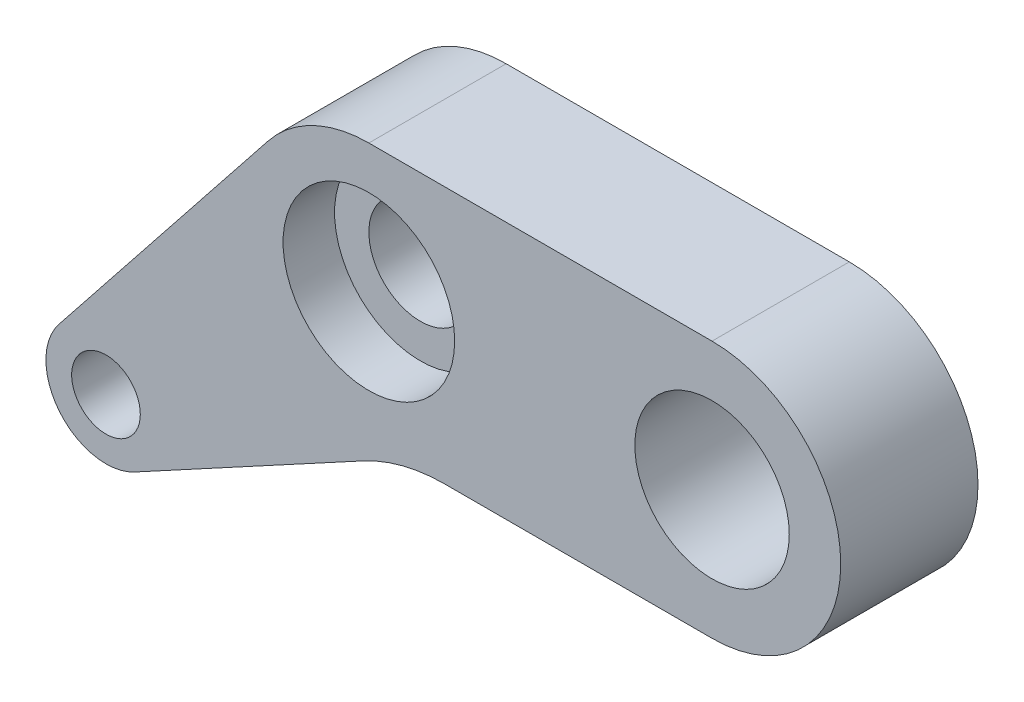
ISO-10303-21;
HEADER;
FILE_DESCRIPTION(('STEP AP214'),'2;1');
FILE_NAME('part.step','',(''),(''),'','','');
FILE_SCHEMA(('AUTOMOTIVE_DESIGN { 1 0 10303 214 1 1 1 1 }'));
ENDSEC;
DATA;
#1=APPLICATION_CONTEXT('core data for automotive mechanical design processes');
#2=APPLICATION_PROTOCOL_DEFINITION('international standard','automotive_design',2000,#1);
#3=PRODUCT_CONTEXT('',#1,'mechanical');
#4=PRODUCT('Part','Part','',(#3));
#5=PRODUCT_RELATED_PRODUCT_CATEGORY('part','',(#4));
#6=PRODUCT_DEFINITION_FORMATION('','',#4);
#7=PRODUCT_DEFINITION_CONTEXT('part definition',#1,'design');
#8=PRODUCT_DEFINITION('design','',#6,#7);
#9=PRODUCT_DEFINITION_SHAPE('','',#8);
#10=(LENGTH_UNIT() NAMED_UNIT(*) SI_UNIT(.MILLI.,.METRE.));
#11=(NAMED_UNIT(*) PLANE_ANGLE_UNIT() SI_UNIT($,.RADIAN.));
#12=(NAMED_UNIT(*) SI_UNIT($,.STERADIAN.) SOLID_ANGLE_UNIT());
#13=UNCERTAINTY_MEASURE_WITH_UNIT(LENGTH_MEASURE(1.E-05),#10,'distance_accuracy_value','');
#14=(GEOMETRIC_REPRESENTATION_CONTEXT(3) GLOBAL_UNCERTAINTY_ASSIGNED_CONTEXT((#13)) GLOBAL_UNIT_ASSIGNED_CONTEXT((#10,
#11,#12)) REPRESENTATION_CONTEXT('',''));
#15=CARTESIAN_POINT('',(0.,0.,0.));
#16=DIRECTION('',(0.,0.,1.));
#17=DIRECTION('',(1.,0.,0.));
#18=AXIS2_PLACEMENT_3D('',#15,#16,#17);
#19=CARTESIAN_POINT('',(-20.,0.,8.));
#20=DIRECTION('',(0.,0.,-1.));
#21=DIRECTION('',(-1.,0.,0.));
#22=AXIS2_PLACEMENT_3D('',#19,#20,#21);
#23=CYLINDRICAL_SURFACE('',#22,3.);
#24=CARTESIAN_POINT('',(-20.,0.,0.));
#25=DIRECTION('',(0.,0.,1.));
#26=DIRECTION('',(1.,0.,0.));
#27=AXIS2_PLACEMENT_3D('',#24,#25,#26);
#28=CIRCLE('',#27,3.);
#29=CARTESIAN_POINT('',(-17.,0.,0.));
#30=VERTEX_POINT('',#29);
#31=EDGE_CURVE('E163',#30,#30,#28,.T.);
#32=ORIENTED_EDGE('',*,*,#31,.F.);
#33=EDGE_LOOP('',(#32));
#34=FACE_BOUND('',#33,.T.);
#35=CARTESIAN_POINT('',(-20.,0.,5.));
#36=DIRECTION('',(0.,0.,1.));
#37=DIRECTION('',(1.,0.,0.));
#38=AXIS2_PLACEMENT_3D('',#35,#36,#37);
#39=CIRCLE('',#38,3.);
#40=CARTESIAN_POINT('',(-17.,0.,5.));
#41=VERTEX_POINT('',#40);
#42=EDGE_CURVE('E53',#41,#41,#39,.T.);
#43=ORIENTED_EDGE('',*,*,#42,.T.);
#44=EDGE_LOOP('',(#43));
#45=FACE_BOUND('',#44,.T.);
#46=ADVANCED_FACE('F49',(#34,#45),#23,.F.);
#47=CARTESIAN_POINT('',(0.,7.5,8.));
#48=DIRECTION('',(0.,-1.,0.));
#49=DIRECTION('',(1.,0.,0.));
#50=AXIS2_PLACEMENT_3D('',#47,#48,#49);
#51=PLANE('',#50);
#52=DIRECTION('',(-1.,0.,0.));
#53=VECTOR('',#52,1.);
#54=CARTESIAN_POINT('',(0.,7.5,0.));
#55=LINE('',#54,#53);
#56=CARTESIAN_POINT('',(0.,7.5,0.));
#57=VERTEX_POINT('',#56);
#58=CARTESIAN_POINT('',(-20.,7.5,0.));
#59=VERTEX_POINT('',#58);
#60=EDGE_CURVE('E142',#57,#59,#55,.T.);
#61=ORIENTED_EDGE('',*,*,#60,.T.);
#62=DIRECTION('',(0.,0.,-1.));
#63=VECTOR('',#62,1.);
#64=CARTESIAN_POINT('',(-20.,7.5,8.));
#65=LINE('',#64,#63);
#66=CARTESIAN_POINT('',(-20.,7.5,8.));
#67=VERTEX_POINT('',#66);
#68=EDGE_CURVE('E120',#67,#59,#65,.T.);
#69=ORIENTED_EDGE('',*,*,#68,.F.);
#70=DIRECTION('',(-1.,0.,0.));
#71=VECTOR('',#70,1.);
#72=CARTESIAN_POINT('',(0.,7.5,8.));
#73=LINE('',#72,#71);
#74=CARTESIAN_POINT('',(0.,7.5,8.));
#75=VERTEX_POINT('',#74);
#76=EDGE_CURVE('E127',#75,#67,#73,.T.);
#77=ORIENTED_EDGE('',*,*,#76,.F.);
#78=DIRECTION('',(0.,0.,-1.));
#79=VECTOR('',#78,1.);
#80=CARTESIAN_POINT('',(0.,7.5,8.));
#81=LINE('',#80,#79);
#82=EDGE_CURVE('E158',#75,#57,#81,.T.);
#83=ORIENTED_EDGE('',*,*,#82,.T.);
#84=EDGE_LOOP('',(#61,#69,#77,#83));
#85=FACE_BOUND('',#84,.T.);
#86=ADVANCED_FACE('F140',(#85),#51,.F.);
#87=CARTESIAN_POINT('',(-20.,0.,8.));
#88=DIRECTION('',(0.,0.,-1.));
#89=DIRECTION('',(-1.,0.,0.));
#90=AXIS2_PLACEMENT_3D('',#87,#88,#89);
#91=CYLINDRICAL_SURFACE('',#90,7.5);
#92=CARTESIAN_POINT('',(-20.,0.,0.));
#93=DIRECTION('',(0.,0.,1.));
#94=DIRECTION('',(1.,0.,0.));
#95=AXIS2_PLACEMENT_3D('',#92,#93,#94);
#96=CIRCLE('',#95,7.5);
#97=CARTESIAN_POINT('',(-25.8725716348244,4.66507260327814,0.));
#98=VERTEX_POINT('',#97);
#99=EDGE_CURVE('E180',#59,#98,#96,.T.);
#100=ORIENTED_EDGE('',*,*,#99,.T.);
#101=DIRECTION('',(0.,0.,-1.));
#102=VECTOR('',#101,1.);
#103=CARTESIAN_POINT('',(-25.8725716348244,4.66507260327814,8.));
#104=LINE('',#103,#102);
#105=CARTESIAN_POINT('',(-25.8725716348244,4.66507260327814,8.));
#106=VERTEX_POINT('',#105);
#107=EDGE_CURVE('E122',#106,#98,#104,.T.);
#108=ORIENTED_EDGE('',*,*,#107,.F.);
#109=CARTESIAN_POINT('',(-20.,0.,8.));
#110=DIRECTION('',(0.,0.,1.));
#111=DIRECTION('',(1.,0.,0.));
#112=AXIS2_PLACEMENT_3D('',#109,#110,#111);
#113=CIRCLE('',#112,7.5);
#114=EDGE_CURVE('E115',#67,#106,#113,.T.);
#115=ORIENTED_EDGE('',*,*,#114,.F.);
#116=ORIENTED_EDGE('',*,*,#68,.T.);
#117=EDGE_LOOP('',(#100,#108,#115,#116));
#118=FACE_BOUND('',#117,.T.);
#119=ADVANCED_FACE('F118',(#118),#91,.T.);
#120=CARTESIAN_POINT('',(-18.1346507836754,14.4058630190675,8.));
#121=DIRECTION('',(-0.783009551309914,0.622009680437087,0.));
#122=DIRECTION('',(-0.622009680437087,-0.783009551309914,0.));
#123=AXIS2_PLACEMENT_3D('',#120,#121,#122);
#124=PLANE('',#123);
#125=DIRECTION('',(0.622009680437087,0.783009551309914,0.));
#126=VECTOR('',#125,1.);
#127=CARTESIAN_POINT('',(-18.1346507836754,14.4058630190675,0.));
#128=LINE('',#127,#126);
#129=CARTESIAN_POINT('',(-38.0614222919642,-10.678718312201,0.));
#130=VERTEX_POINT('',#129);
#131=EDGE_CURVE('E177',#130,#98,#128,.T.);
#132=ORIENTED_EDGE('',*,*,#131,.F.);
#133=DIRECTION('',(0.,0.,-1.));
#134=VECTOR('',#133,1.);
#135=CARTESIAN_POINT('',(-38.0614222919642,-10.678718312201,8.));
#136=LINE('',#135,#134);
#137=CARTESIAN_POINT('',(-38.0614222919642,-10.678718312201,8.));
#138=VERTEX_POINT('',#137);
#139=EDGE_CURVE('E147',#138,#130,#136,.T.);
#140=ORIENTED_EDGE('',*,*,#139,.F.);
#141=DIRECTION('',(0.622009680437087,0.783009551309914,0.));
#142=VECTOR('',#141,1.);
#143=CARTESIAN_POINT('',(-18.1346507836754,14.4058630190675,8.));
#144=LINE('',#143,#142);
#145=EDGE_CURVE('E126',#138,#106,#144,.T.);
#146=ORIENTED_EDGE('',*,*,#145,.T.);
#147=ORIENTED_EDGE('',*,*,#107,.T.);
#148=EDGE_LOOP('',(#132,#140,#146,#147));
#149=FACE_BOUND('',#148,.T.);
#150=ADVANCED_FACE('F246',(#149),#124,.T.);
#151=CARTESIAN_POINT('',(-35.3208888623795,-12.8557521937308,8.));
#152=DIRECTION('',(0.,0.,-1.));
#153=DIRECTION('',(-1.,0.,0.));
#154=AXIS2_PLACEMENT_3D('',#151,#152,#153);
#155=CYLINDRICAL_SURFACE('',#154,3.5);
#156=CARTESIAN_POINT('',(-35.3208888623795,-12.8557521937308,0.));
#157=DIRECTION('',(0.,0.,1.));
#158=DIRECTION('',(1.,0.,0.));
#159=AXIS2_PLACEMENT_3D('',#156,#157,#158);
#160=CIRCLE('',#159,3.5);
#161=CARTESIAN_POINT('',(-33.6528176531614,-15.9326887288218,0.));
#162=VERTEX_POINT('',#161);
#163=EDGE_CURVE('E175',#130,#162,#160,.T.);
#164=ORIENTED_EDGE('',*,*,#163,.T.);
#165=DIRECTION('',(0.,0.,-1.));
#166=VECTOR('',#165,1.);
#167=CARTESIAN_POINT('',(-33.6528176531614,-15.9326887288218,8.));
#168=LINE('',#167,#166);
#169=CARTESIAN_POINT('',(-33.6528176531614,-15.9326887288218,8.));
#170=VERTEX_POINT('',#169);
#171=EDGE_CURVE('E153',#170,#162,#168,.T.);
#172=ORIENTED_EDGE('',*,*,#171,.F.);
#173=CARTESIAN_POINT('',(-35.3208888623795,-12.8557521937308,8.));
#174=DIRECTION('',(0.,0.,1.));
#175=DIRECTION('',(1.,0.,0.));
#176=AXIS2_PLACEMENT_3D('',#173,#174,#175);
#177=CIRCLE('',#176,3.5);
#178=EDGE_CURVE('E194',#138,#170,#177,.T.);
#179=ORIENTED_EDGE('',*,*,#178,.F.);
#180=ORIENTED_EDGE('',*,*,#139,.T.);
#181=EDGE_LOOP('',(#164,#172,#179,#180));
#182=FACE_BOUND('',#181,.T.);
#183=ADVANCED_FACE('F243',(#182),#155,.T.);
#184=CARTESIAN_POINT('',(-0.96835607661003,1.78623680729754,8.));
#185=DIRECTION('',(-0.476591774062324,0.879124724311703,0.));
#186=DIRECTION('',(-0.879124724311703,-0.476591774062324,0.));
#187=AXIS2_PLACEMENT_3D('',#184,#185,#186);
#188=PLANE('',#187);
#189=DIRECTION('',(0.879124724311703,0.476591774062324,0.));
#190=VECTOR('',#189,1.);
#191=CARTESIAN_POINT('',(-0.96835607661003,1.78623680729754,0.));
#192=LINE('',#191,#190);
#193=CARTESIAN_POINT('',(-20.327491733991,-8.70875275688297,0.));
#194=VERTEX_POINT('',#193);
#195=EDGE_CURVE('E173',#162,#194,#192,.T.);
#196=ORIENTED_EDGE('',*,*,#195,.T.);
#197=DIRECTION('',(0.,0.,-1.));
#198=VECTOR('',#197,1.);
#199=CARTESIAN_POINT('',(-20.327491733991,-8.70875275688297,8.));
#200=LINE('',#199,#198);
#201=CARTESIAN_POINT('',(-20.327491733991,-8.70875275688297,8.));
#202=VERTEX_POINT('',#201);
#203=EDGE_CURVE('E65',#194,#202,#200,.F.);
#204=ORIENTED_EDGE('',*,*,#203,.T.);
#205=DIRECTION('',(0.879124724311703,0.476591774062324,0.));
#206=VECTOR('',#205,1.);
#207=CARTESIAN_POINT('',(-0.96835607661003,1.78623680729754,8.));
#208=LINE('',#207,#206);
#209=EDGE_CURVE('E192',#170,#202,#208,.T.);
#210=ORIENTED_EDGE('',*,*,#209,.F.);
#211=ORIENTED_EDGE('',*,*,#171,.T.);
#212=EDGE_LOOP('',(#196,#204,#210,#211));
#213=FACE_BOUND('',#212,.T.);
#214=ADVANCED_FACE('F239',(#213),#188,.F.);
#215=CARTESIAN_POINT('',(0.,-7.5,8.));
#216=DIRECTION('',(0.,-1.,0.));
#217=DIRECTION('',(1.,0.,0.));
#218=AXIS2_PLACEMENT_3D('',#215,#216,#217);
#219=PLANE('',#218);
#220=DIRECTION('',(-1.,0.,0.));
#221=VECTOR('',#220,1.);
#222=CARTESIAN_POINT('',(0.,-7.5,8.));
#223=LINE('',#222,#221);
#224=CARTESIAN_POINT('',(0.,-7.5,8.));
#225=VERTEX_POINT('',#224);
#226=CARTESIAN_POINT('',(-15.5615739933678,-7.5,8.));
#227=VERTEX_POINT('',#226);
#228=EDGE_CURVE('E189',#225,#227,#223,.T.);
#229=ORIENTED_EDGE('',*,*,#228,.T.);
#230=DIRECTION('',(0.,0.,-1.));
#231=VECTOR('',#230,1.);
#232=CARTESIAN_POINT('',(-15.5615739933678,-7.5,8.));
#233=LINE('',#232,#231);
#234=CARTESIAN_POINT('',(-15.5615739933678,-7.5,0.));
#235=VERTEX_POINT('',#234);
#236=EDGE_CURVE('E143',#227,#235,#233,.T.);
#237=ORIENTED_EDGE('',*,*,#236,.T.);
#238=DIRECTION('',(-1.,0.,0.));
#239=VECTOR('',#238,1.);
#240=CARTESIAN_POINT('',(0.,-7.5,0.));
#241=LINE('',#240,#239);
#242=CARTESIAN_POINT('',(0.,-7.5,0.));
#243=VERTEX_POINT('',#242);
#244=EDGE_CURVE('E171',#243,#235,#241,.T.);
#245=ORIENTED_EDGE('',*,*,#244,.F.);
#246=DIRECTION('',(0.,0.,-1.));
#247=VECTOR('',#246,1.);
#248=CARTESIAN_POINT('',(0.,-7.5,8.));
#249=LINE('',#248,#247);
#250=EDGE_CURVE('E156',#225,#243,#249,.T.);
#251=ORIENTED_EDGE('',*,*,#250,.F.);
#252=EDGE_LOOP('',(#229,#237,#245,#251));
#253=FACE_BOUND('',#252,.T.);
#254=ADVANCED_FACE('F232',(#253),#219,.T.);
#255=CARTESIAN_POINT('',(-35.3208888623795,-12.8557521937308,8.));
#256=DIRECTION('',(0.,0.,-1.));
#257=DIRECTION('',(-1.,0.,0.));
#258=AXIS2_PLACEMENT_3D('',#255,#256,#257);
#259=CYLINDRICAL_SURFACE('',#258,2.);
#260=CARTESIAN_POINT('',(-35.3208888623795,-12.8557521937308,8.));
#261=DIRECTION('',(0.,0.,1.));
#262=DIRECTION('',(1.,0.,0.));
#263=AXIS2_PLACEMENT_3D('',#260,#261,#262);
#264=CIRCLE('',#263,2.);
#265=CARTESIAN_POINT('',(-33.3208888623795,-12.8557521937308,8.));
#266=VERTEX_POINT('',#265);
#267=EDGE_CURVE('E185',#266,#266,#264,.T.);
#268=ORIENTED_EDGE('',*,*,#267,.T.);
#269=EDGE_LOOP('',(#268));
#270=FACE_BOUND('',#269,.T.);
#271=CARTESIAN_POINT('',(-35.3208888623795,-12.8557521937308,0.));
#272=DIRECTION('',(0.,0.,1.));
#273=DIRECTION('',(1.,0.,0.));
#274=AXIS2_PLACEMENT_3D('',#271,#272,#273);
#275=CIRCLE('',#274,2.);
#276=CARTESIAN_POINT('',(-33.3208888623795,-12.8557521937308,0.));
#277=VERTEX_POINT('',#276);
#278=EDGE_CURVE('E166',#277,#277,#275,.T.);
#279=ORIENTED_EDGE('',*,*,#278,.F.);
#280=EDGE_LOOP('',(#279));
#281=FACE_BOUND('',#280,.T.);
#282=ADVANCED_FACE('F228',(#270,#281),#259,.F.);
#283=CARTESIAN_POINT('',(0.,0.,8.));
#284=DIRECTION('',(0.,0.,-1.));
#285=DIRECTION('',(-1.,0.,0.));
#286=AXIS2_PLACEMENT_3D('',#283,#284,#285);
#287=CYLINDRICAL_SURFACE('',#286,7.5);
#288=CARTESIAN_POINT('',(0.,0.,0.));
#289=DIRECTION('',(0.,0.,1.));
#290=DIRECTION('',(1.,0.,0.));
#291=AXIS2_PLACEMENT_3D('',#288,#289,#290);
#292=CIRCLE('',#291,7.5);
#293=EDGE_CURVE('E169',#243,#57,#292,.T.);
#294=ORIENTED_EDGE('',*,*,#293,.T.);
#295=ORIENTED_EDGE('',*,*,#82,.F.);
#296=CARTESIAN_POINT('',(0.,0.,8.));
#297=DIRECTION('',(0.,0.,1.));
#298=DIRECTION('',(1.,0.,0.));
#299=AXIS2_PLACEMENT_3D('',#296,#297,#298);
#300=CIRCLE('',#299,7.5);
#301=EDGE_CURVE('E134',#225,#75,#300,.T.);
#302=ORIENTED_EDGE('',*,*,#301,.F.);
#303=ORIENTED_EDGE('',*,*,#250,.T.);
#304=EDGE_LOOP('',(#294,#295,#302,#303));
#305=FACE_BOUND('',#304,.T.);
#306=ADVANCED_FACE('F231',(#305),#287,.T.);
#307=CARTESIAN_POINT('',(0.,0.,8.));
#308=DIRECTION('',(0.,0.,-1.));
#309=DIRECTION('',(-1.,0.,0.));
#310=AXIS2_PLACEMENT_3D('',#307,#308,#309);
#311=CYLINDRICAL_SURFACE('',#310,4.5);
#312=CARTESIAN_POINT('',(0.,0.,8.));
#313=DIRECTION('',(0.,0.,1.));
#314=DIRECTION('',(1.,0.,0.));
#315=AXIS2_PLACEMENT_3D('',#312,#313,#314);
#316=CIRCLE('',#315,4.5);
#317=CARTESIAN_POINT('',(4.5,0.,8.));
#318=VERTEX_POINT('',#317);
#319=EDGE_CURVE('E160',#318,#318,#316,.T.);
#320=ORIENTED_EDGE('',*,*,#319,.T.);
#321=EDGE_LOOP('',(#320));
#322=FACE_BOUND('',#321,.T.);
#323=CARTESIAN_POINT('',(0.,0.,0.));
#324=DIRECTION('',(0.,0.,1.));
#325=DIRECTION('',(1.,0.,0.));
#326=AXIS2_PLACEMENT_3D('',#323,#324,#325);
#327=CIRCLE('',#326,4.5);
#328=CARTESIAN_POINT('',(4.5,0.,0.));
#329=VERTEX_POINT('',#328);
#330=EDGE_CURVE('E138',#329,#329,#327,.T.);
#331=ORIENTED_EDGE('',*,*,#330,.F.);
#332=EDGE_LOOP('',(#331));
#333=FACE_BOUND('',#332,.T.);
#334=ADVANCED_FACE('F226',(#322,#333),#311,.F.);
#335=CARTESIAN_POINT('',(0.,0.,8.));
#336=DIRECTION('',(0.,0.,1.));
#337=DIRECTION('',(1.,0.,0.));
#338=AXIS2_PLACEMENT_3D('',#335,#336,#337);
#339=PLANE('',#338);
#340=CARTESIAN_POINT('',(-20.,0.,8.));
#341=DIRECTION('',(0.,0.,1.));
#342=DIRECTION('',(1.,0.,0.));
#343=AXIS2_PLACEMENT_3D('',#340,#341,#342);
#344=CIRCLE('',#343,5.);
#345=CARTESIAN_POINT('',(-15.,0.,8.));
#346=VERTEX_POINT('',#345);
#347=EDGE_CURVE('E197',#346,#346,#344,.T.);
#348=ORIENTED_EDGE('',*,*,#347,.F.);
#349=EDGE_LOOP('',(#348));
#350=FACE_BOUND('',#349,.T.);
#351=ORIENTED_EDGE('',*,*,#76,.T.);
#352=ORIENTED_EDGE('',*,*,#114,.T.);
#353=ORIENTED_EDGE('',*,*,#145,.F.);
#354=ORIENTED_EDGE('',*,*,#178,.T.);
#355=ORIENTED_EDGE('',*,*,#209,.T.);
#356=CARTESIAN_POINT('',(-15.5615739933678,-17.5,8.));
#357=DIRECTION('',(0.,0.,1.));
#358=DIRECTION('',(1.,0.,0.));
#359=AXIS2_PLACEMENT_3D('',#356,#357,#358);
#360=CIRCLE('',#359,10.);
#361=EDGE_CURVE('E13',#202,#227,#360,.F.);
#362=ORIENTED_EDGE('',*,*,#361,.T.);
#363=ORIENTED_EDGE('',*,*,#228,.F.);
#364=ORIENTED_EDGE('',*,*,#301,.T.);
#365=EDGE_LOOP('',(#351,#352,#353,#354,#355,#362,#363,#364));
#366=FACE_BOUND('',#365,.T.);
#367=ORIENTED_EDGE('',*,*,#267,.F.);
#368=EDGE_LOOP('',(#367));
#369=FACE_BOUND('',#368,.T.);
#370=ORIENTED_EDGE('',*,*,#319,.F.);
#371=EDGE_LOOP('',(#370));
#372=FACE_BOUND('',#371,.T.);
#373=ADVANCED_FACE('F130',(#350,#366,#369,#372),#339,.T.);
#374=CARTESIAN_POINT('',(0.,0.,0.));
#375=DIRECTION('',(0.,0.,1.));
#376=DIRECTION('',(1.,0.,0.));
#377=AXIS2_PLACEMENT_3D('',#374,#375,#376);
#378=PLANE('',#377);
#379=ORIENTED_EDGE('',*,*,#60,.F.);
#380=ORIENTED_EDGE('',*,*,#293,.F.);
#381=ORIENTED_EDGE('',*,*,#244,.T.);
#382=CARTESIAN_POINT('',(-15.5615739933678,-17.5,0.));
#383=DIRECTION('',(0.,0.,1.));
#384=DIRECTION('',(1.,0.,0.));
#385=AXIS2_PLACEMENT_3D('',#382,#383,#384);
#386=CIRCLE('',#385,10.);
#387=EDGE_CURVE('E58',#235,#194,#386,.T.);
#388=ORIENTED_EDGE('',*,*,#387,.T.);
#389=ORIENTED_EDGE('',*,*,#195,.F.);
#390=ORIENTED_EDGE('',*,*,#163,.F.);
#391=ORIENTED_EDGE('',*,*,#131,.T.);
#392=ORIENTED_EDGE('',*,*,#99,.F.);
#393=EDGE_LOOP('',(#379,#380,#381,#388,#389,#390,#391,#392));
#394=FACE_BOUND('',#393,.T.);
#395=ORIENTED_EDGE('',*,*,#278,.T.);
#396=EDGE_LOOP('',(#395));
#397=FACE_BOUND('',#396,.T.);
#398=ORIENTED_EDGE('',*,*,#31,.T.);
#399=EDGE_LOOP('',(#398));
#400=FACE_BOUND('',#399,.T.);
#401=ORIENTED_EDGE('',*,*,#330,.T.);
#402=EDGE_LOOP('',(#401));
#403=FACE_BOUND('',#402,.T.);
#404=ADVANCED_FACE('F293',(#394,#397,#400,#403),#378,.F.);
#405=CARTESIAN_POINT('',(-15.5615739933678,-17.5,8.));
#406=DIRECTION('',(0.,0.,-1.));
#407=DIRECTION('',(-1.,0.,0.));
#408=AXIS2_PLACEMENT_3D('',#405,#406,#407);
#409=CYLINDRICAL_SURFACE('',#408,10.);
#410=ORIENTED_EDGE('',*,*,#361,.F.);
#411=ORIENTED_EDGE('',*,*,#203,.F.);
#412=ORIENTED_EDGE('',*,*,#387,.F.);
#413=ORIENTED_EDGE('',*,*,#236,.F.);
#414=EDGE_LOOP('',(#410,#411,#412,#413));
#415=FACE_BOUND('',#414,.T.);
#416=ADVANCED_FACE('F51',(#415),#409,.F.);
#417=CARTESIAN_POINT('',(-20.,0.,5.));
#418=DIRECTION('',(0.,0.,1.));
#419=DIRECTION('',(1.,0.,0.));
#420=AXIS2_PLACEMENT_3D('',#417,#418,#419);
#421=CYLINDRICAL_SURFACE('',#420,5.);
#422=CARTESIAN_POINT('',(-20.,0.,5.));
#423=DIRECTION('',(0.,0.,1.));
#424=DIRECTION('',(1.,0.,0.));
#425=AXIS2_PLACEMENT_3D('',#422,#423,#424);
#426=CIRCLE('',#425,5.);
#427=CARTESIAN_POINT('',(-15.,0.,5.));
#428=VERTEX_POINT('',#427);
#429=EDGE_CURVE('E200',#428,#428,#426,.T.);
#430=ORIENTED_EDGE('',*,*,#429,.F.);
#431=EDGE_LOOP('',(#430));
#432=FACE_BOUND('',#431,.T.);
#433=ORIENTED_EDGE('',*,*,#347,.T.);
#434=EDGE_LOOP('',(#433));
#435=FACE_BOUND('',#434,.T.);
#436=ADVANCED_FACE('F210',(#432,#435),#421,.F.);
#437=CARTESIAN_POINT('',(-20.,0.,5.));
#438=DIRECTION('',(0.,0.,1.));
#439=DIRECTION('',(1.,0.,0.));
#440=AXIS2_PLACEMENT_3D('',#437,#438,#439);
#441=PLANE('',#440);
#442=ORIENTED_EDGE('',*,*,#42,.F.);
#443=EDGE_LOOP('',(#442));
#444=FACE_BOUND('',#443,.T.);
#445=ORIENTED_EDGE('',*,*,#429,.T.);
#446=EDGE_LOOP('',(#445));
#447=FACE_BOUND('',#446,.T.);
#448=ADVANCED_FACE('F208',(#444,#447),#441,.T.);
#449=CLOSED_SHELL('',(#46,#86,#119,#150,#183,#214,#254,#282,#306,#334,#373,#404,#416,#436,#448));
#450=MANIFOLD_SOLID_BREP('B2',#449);
#451=ADVANCED_BREP_SHAPE_REPRESENTATION('',(#18,#450),#14);
#452=SHAPE_DEFINITION_REPRESENTATION(#9,#451);
ENDSEC;
END-ISO-10303-21;
